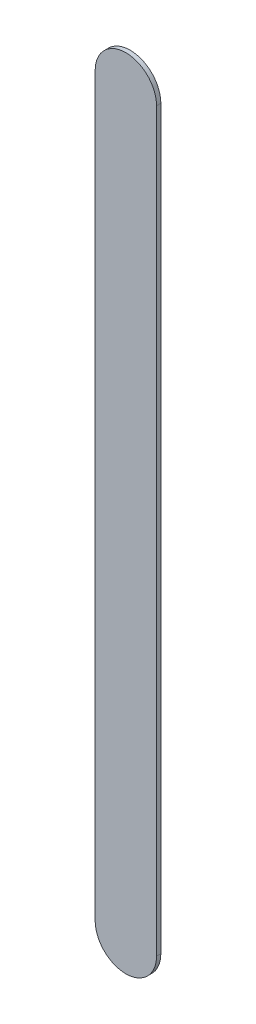
ISO-10303-21;
HEADER;
FILE_DESCRIPTION(('STEP AP214'),'2;1');
FILE_NAME('part.step','',(''),(''),'','','');
FILE_SCHEMA(('AUTOMOTIVE_DESIGN { 1 0 10303 214 1 1 1 1 }'));
ENDSEC;
DATA;
#1=APPLICATION_CONTEXT('core data for automotive mechanical design processes');
#2=APPLICATION_PROTOCOL_DEFINITION('international standard','automotive_design',2000,#1);
#3=PRODUCT_CONTEXT('',#1,'mechanical');
#4=PRODUCT('Part','Part','',(#3));
#5=PRODUCT_RELATED_PRODUCT_CATEGORY('part','',(#4));
#6=PRODUCT_DEFINITION_FORMATION('','',#4);
#7=PRODUCT_DEFINITION_CONTEXT('part definition',#1,'design');
#8=PRODUCT_DEFINITION('design','',#6,#7);
#9=PRODUCT_DEFINITION_SHAPE('','',#8);
#10=(LENGTH_UNIT() NAMED_UNIT(*) SI_UNIT(.MILLI.,.METRE.));
#11=(NAMED_UNIT(*) PLANE_ANGLE_UNIT() SI_UNIT($,.RADIAN.));
#12=(NAMED_UNIT(*) SI_UNIT($,.STERADIAN.) SOLID_ANGLE_UNIT());
#13=UNCERTAINTY_MEASURE_WITH_UNIT(LENGTH_MEASURE(1.E-05),#10,'distance_accuracy_value','');
#14=(GEOMETRIC_REPRESENTATION_CONTEXT(3) GLOBAL_UNCERTAINTY_ASSIGNED_CONTEXT((#13)) GLOBAL_UNIT_ASSIGNED_CONTEXT((#10,
#11,#12)) REPRESENTATION_CONTEXT('',''));
#15=CARTESIAN_POINT('',(0.,0.,0.));
#16=DIRECTION('',(0.,0.,1.));
#17=DIRECTION('',(1.,0.,0.));
#18=AXIS2_PLACEMENT_3D('',#15,#16,#17);
#19=CARTESIAN_POINT('',(100.85,-106.9,1.635));
#20=DIRECTION('',(0.,0.,1.));
#21=DIRECTION('',(1.,0.,0.));
#22=AXIS2_PLACEMENT_3D('',#19,#20,#21);
#23=PLANE('',#22);
#24=DIRECTION('',(0.,-1.,0.));
#25=VECTOR('',#24,1.);
#26=CARTESIAN_POINT('',(100.85,-106.9,1.635));
#27=LINE('',#26,#25);
#28=CARTESIAN_POINT('',(100.85,-106.9,1.635));
#29=VERTEX_POINT('',#28);
#30=CARTESIAN_POINT('',(100.85,-112.9,1.635));
#31=VERTEX_POINT('',#30);
#32=EDGE_CURVE('E83',#29,#31,#27,.T.);
#33=ORIENTED_EDGE('',*,*,#32,.T.);
#34=CARTESIAN_POINT('',(101.1,-112.9,1.635));
#35=DIRECTION('',(0.,0.,1.));
#36=DIRECTION('',(-1.,0.,0.));
#37=AXIS2_PLACEMENT_3D('',#34,#35,#36);
#38=CIRCLE('',#37,0.25);
#39=CARTESIAN_POINT('',(101.35,-112.9,1.635));
#40=VERTEX_POINT('',#39);
#41=EDGE_CURVE('E109',#31,#40,#38,.T.);
#42=ORIENTED_EDGE('',*,*,#41,.T.);
#43=DIRECTION('',(0.,1.,0.));
#44=VECTOR('',#43,1.);
#45=CARTESIAN_POINT('',(101.35,-112.9,1.635));
#46=LINE('',#45,#44);
#47=CARTESIAN_POINT('',(101.35,-106.9,1.635));
#48=VERTEX_POINT('',#47);
#49=EDGE_CURVE('E75',#40,#48,#46,.T.);
#50=ORIENTED_EDGE('',*,*,#49,.T.);
#51=CARTESIAN_POINT('',(101.1,-106.9,1.635));
#52=DIRECTION('',(0.,0.,1.));
#53=DIRECTION('',(1.,0.,0.));
#54=AXIS2_PLACEMENT_3D('',#51,#52,#53);
#55=CIRCLE('',#54,0.25);
#56=EDGE_CURVE('E11',#48,#29,#55,.T.);
#57=ORIENTED_EDGE('',*,*,#56,.T.);
#58=EDGE_LOOP('',(#33,#42,#50,#57));
#59=FACE_BOUND('',#58,.T.);
#60=ADVANCED_FACE('F17',(#59),#23,.T.);
#61=CARTESIAN_POINT('',(100.85,-106.9,1.6));
#62=DIRECTION('',(0.,0.,1.));
#63=DIRECTION('',(1.,0.,0.));
#64=AXIS2_PLACEMENT_3D('',#61,#62,#63);
#65=PLANE('',#64);
#66=CARTESIAN_POINT('',(101.1,-106.9,1.6));
#67=DIRECTION('',(0.,0.,1.));
#68=DIRECTION('',(1.,0.,0.));
#69=AXIS2_PLACEMENT_3D('',#66,#67,#68);
#70=CIRCLE('',#69,0.25);
#71=CARTESIAN_POINT('',(101.35,-106.9,1.6));
#72=VERTEX_POINT('',#71);
#73=CARTESIAN_POINT('',(100.85,-106.9,1.6));
#74=VERTEX_POINT('',#73);
#75=EDGE_CURVE('E26',#72,#74,#70,.T.);
#76=ORIENTED_EDGE('',*,*,#75,.F.);
#77=DIRECTION('',(0.,1.,0.));
#78=VECTOR('',#77,1.);
#79=CARTESIAN_POINT('',(101.35,-112.9,1.6));
#80=LINE('',#79,#78);
#81=CARTESIAN_POINT('',(101.35,-112.9,1.6));
#82=VERTEX_POINT('',#81);
#83=EDGE_CURVE('E20',#82,#72,#80,.T.);
#84=ORIENTED_EDGE('',*,*,#83,.F.);
#85=CARTESIAN_POINT('',(101.1,-112.9,1.6));
#86=DIRECTION('',(0.,0.,1.));
#87=DIRECTION('',(-1.,0.,0.));
#88=AXIS2_PLACEMENT_3D('',#85,#86,#87);
#89=CIRCLE('',#88,0.25);
#90=CARTESIAN_POINT('',(100.85,-112.9,1.6));
#91=VERTEX_POINT('',#90);
#92=EDGE_CURVE('E85',#91,#82,#89,.T.);
#93=ORIENTED_EDGE('',*,*,#92,.F.);
#94=DIRECTION('',(0.,-1.,0.));
#95=VECTOR('',#94,1.);
#96=CARTESIAN_POINT('',(100.85,-106.9,1.6));
#97=LINE('',#96,#95);
#98=EDGE_CURVE('E81',#74,#91,#97,.T.);
#99=ORIENTED_EDGE('',*,*,#98,.F.);
#100=EDGE_LOOP('',(#76,#84,#93,#99));
#101=FACE_BOUND('',#100,.T.);
#102=ADVANCED_FACE('F87',(#101),#65,.F.);
#103=CARTESIAN_POINT('',(101.1,-106.9,1.6));
#104=DIRECTION('',(0.,0.,-1.));
#105=DIRECTION('',(1.,0.,0.));
#106=AXIS2_PLACEMENT_3D('',#103,#104,#105);
#107=CYLINDRICAL_SURFACE('',#106,0.25);
#108=ORIENTED_EDGE('',*,*,#75,.T.);
#109=DIRECTION('',(0.,0.,1.));
#110=VECTOR('',#109,1.);
#111=CARTESIAN_POINT('',(100.85,-106.9,1.6));
#112=LINE('',#111,#110);
#113=EDGE_CURVE('E69',#74,#29,#112,.T.);
#114=ORIENTED_EDGE('',*,*,#113,.T.);
#115=ORIENTED_EDGE('',*,*,#56,.F.);
#116=DIRECTION('',(0.,0.,1.));
#117=VECTOR('',#116,1.);
#118=CARTESIAN_POINT('',(101.35,-106.9,1.6));
#119=LINE('',#118,#117);
#120=EDGE_CURVE('E72',#72,#48,#119,.T.);
#121=ORIENTED_EDGE('',*,*,#120,.F.);
#122=EDGE_LOOP('',(#108,#114,#115,#121));
#123=FACE_BOUND('',#122,.T.);
#124=ADVANCED_FACE('F68',(#123),#107,.T.);
#125=CARTESIAN_POINT('',(101.35,-112.9,1.6));
#126=DIRECTION('',(-1.,0.,0.));
#127=DIRECTION('',(0.,0.,1.));
#128=AXIS2_PLACEMENT_3D('',#125,#126,#127);
#129=PLANE('',#128);
#130=ORIENTED_EDGE('',*,*,#83,.T.);
#131=ORIENTED_EDGE('',*,*,#120,.T.);
#132=ORIENTED_EDGE('',*,*,#49,.F.);
#133=DIRECTION('',(0.,0.,1.));
#134=VECTOR('',#133,1.);
#135=CARTESIAN_POINT('',(101.35,-112.9,1.6));
#136=LINE('',#135,#134);
#137=EDGE_CURVE('E100',#82,#40,#136,.T.);
#138=ORIENTED_EDGE('',*,*,#137,.F.);
#139=EDGE_LOOP('',(#130,#131,#132,#138));
#140=FACE_BOUND('',#139,.T.);
#141=ADVANCED_FACE('F124',(#140),#129,.F.);
#142=CARTESIAN_POINT('',(101.1,-112.9,1.6));
#143=DIRECTION('',(0.,0.,-1.));
#144=DIRECTION('',(-1.,0.,0.));
#145=AXIS2_PLACEMENT_3D('',#142,#143,#144);
#146=CYLINDRICAL_SURFACE('',#145,0.25);
#147=ORIENTED_EDGE('',*,*,#92,.T.);
#148=ORIENTED_EDGE('',*,*,#137,.T.);
#149=ORIENTED_EDGE('',*,*,#41,.F.);
#150=DIRECTION('',(0.,0.,1.));
#151=VECTOR('',#150,1.);
#152=CARTESIAN_POINT('',(100.85,-112.9,1.6));
#153=LINE('',#152,#151);
#154=EDGE_CURVE('E91',#91,#31,#153,.T.);
#155=ORIENTED_EDGE('',*,*,#154,.F.);
#156=EDGE_LOOP('',(#147,#148,#149,#155));
#157=FACE_BOUND('',#156,.T.);
#158=ADVANCED_FACE('F122',(#157),#146,.T.);
#159=CARTESIAN_POINT('',(100.85,-106.9,1.6));
#160=DIRECTION('',(1.,0.,0.));
#161=DIRECTION('',(0.,1.,0.));
#162=AXIS2_PLACEMENT_3D('',#159,#160,#161);
#163=PLANE('',#162);
#164=ORIENTED_EDGE('',*,*,#98,.T.);
#165=ORIENTED_EDGE('',*,*,#154,.T.);
#166=ORIENTED_EDGE('',*,*,#32,.F.);
#167=ORIENTED_EDGE('',*,*,#113,.F.);
#168=EDGE_LOOP('',(#164,#165,#166,#167));
#169=FACE_BOUND('',#168,.T.);
#170=ADVANCED_FACE('F79',(#169),#163,.F.);
#171=CLOSED_SHELL('',(#60,#102,#124,#141,#158,#170));
#172=MANIFOLD_SOLID_BREP('B1',#171);
#173=ADVANCED_BREP_SHAPE_REPRESENTATION('',(#18,#172),#14);
#174=SHAPE_DEFINITION_REPRESENTATION(#9,#173);
ENDSEC;
END-ISO-10303-21;
